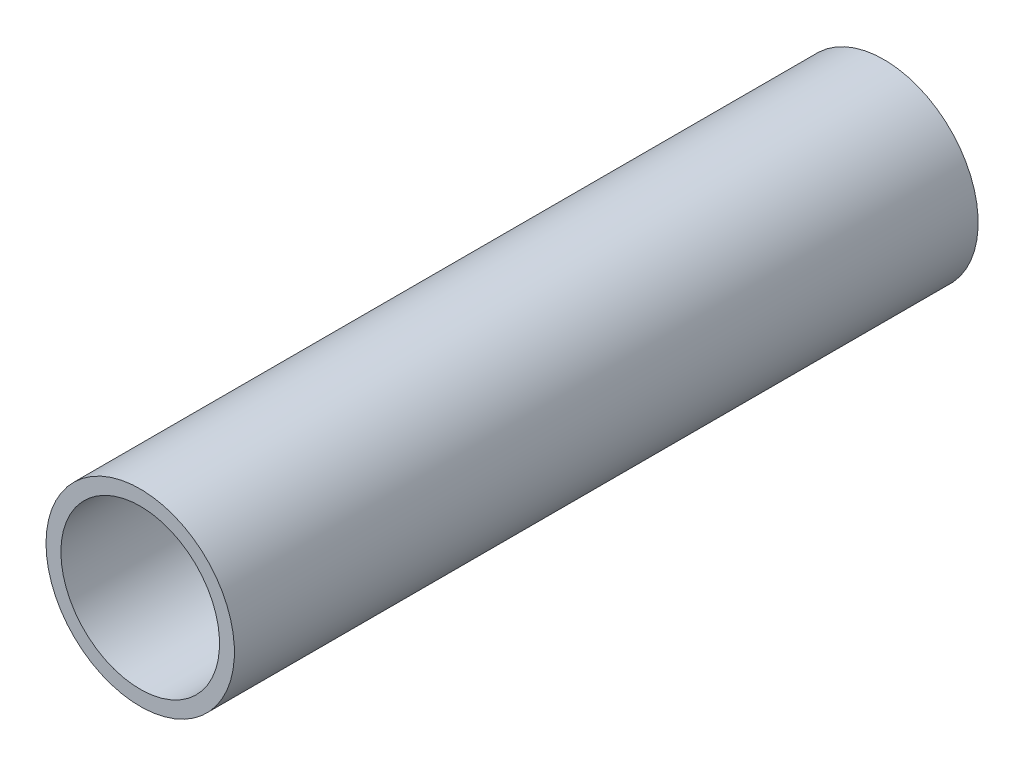
ISO-10303-21;
HEADER;
FILE_DESCRIPTION(('STEP AP214'),'2;1');
FILE_NAME('part.step','',(''),(''),'','','');
FILE_SCHEMA(('AUTOMOTIVE_DESIGN { 1 0 10303 214 1 1 1 1 }'));
ENDSEC;
DATA;
#1=APPLICATION_CONTEXT('core data for automotive mechanical design processes');
#2=APPLICATION_PROTOCOL_DEFINITION('international standard','automotive_design',2000,#1);
#3=PRODUCT_CONTEXT('',#1,'mechanical');
#4=PRODUCT('Part','Part','',(#3));
#5=PRODUCT_RELATED_PRODUCT_CATEGORY('part','',(#4));
#6=PRODUCT_DEFINITION_FORMATION('','',#4);
#7=PRODUCT_DEFINITION_CONTEXT('part definition',#1,'design');
#8=PRODUCT_DEFINITION('design','',#6,#7);
#9=PRODUCT_DEFINITION_SHAPE('','',#8);
#10=(LENGTH_UNIT() NAMED_UNIT(*) SI_UNIT(.MILLI.,.METRE.));
#11=(NAMED_UNIT(*) PLANE_ANGLE_UNIT() SI_UNIT($,.RADIAN.));
#12=(NAMED_UNIT(*) SI_UNIT($,.STERADIAN.) SOLID_ANGLE_UNIT());
#13=UNCERTAINTY_MEASURE_WITH_UNIT(LENGTH_MEASURE(1.E-05),#10,'distance_accuracy_value','');
#14=(GEOMETRIC_REPRESENTATION_CONTEXT(3) GLOBAL_UNCERTAINTY_ASSIGNED_CONTEXT((#13)) GLOBAL_UNIT_ASSIGNED_CONTEXT((#10,
#11,#12)) REPRESENTATION_CONTEXT('',''));
#15=CARTESIAN_POINT('',(0.,0.,0.));
#16=DIRECTION('',(0.,0.,1.));
#17=DIRECTION('',(1.,0.,0.));
#18=AXIS2_PLACEMENT_3D('',#15,#16,#17);
#19=CARTESIAN_POINT('',(-43.,18.,37.5));
#20=DIRECTION('',(0.,0.,-1.));
#21=DIRECTION('',(-1.,0.,0.));
#22=AXIS2_PLACEMENT_3D('',#19,#20,#21);
#23=CYLINDRICAL_SURFACE('',#22,8.00000000000001);
#24=CARTESIAN_POINT('',(-43.,18.,-37.5));
#25=DIRECTION('',(0.,0.,-1.));
#26=DIRECTION('',(-1.,0.,0.));
#27=AXIS2_PLACEMENT_3D('',#24,#25,#26);
#28=CIRCLE('',#27,8.00000000000001);
#29=CARTESIAN_POINT('',(-51.,18.,-37.5));
#30=VERTEX_POINT('',#29);
#31=EDGE_CURVE('E27',#30,#30,#28,.T.);
#32=ORIENTED_EDGE('',*,*,#31,.T.);
#33=EDGE_LOOP('',(#32));
#34=FACE_BOUND('',#33,.T.);
#35=CARTESIAN_POINT('',(-43.,18.,37.5));
#36=DIRECTION('',(0.,0.,-1.));
#37=DIRECTION('',(-1.,0.,0.));
#38=AXIS2_PLACEMENT_3D('',#35,#36,#37);
#39=CIRCLE('',#38,8.00000000000001);
#40=CARTESIAN_POINT('',(-51.,18.,37.5));
#41=VERTEX_POINT('',#40);
#42=EDGE_CURVE('E18',#41,#41,#39,.T.);
#43=ORIENTED_EDGE('',*,*,#42,.F.);
#44=EDGE_LOOP('',(#43));
#45=FACE_BOUND('',#44,.T.);
#46=ADVANCED_FACE('F15',(#34,#45),#23,.F.);
#47=CARTESIAN_POINT('',(-43.,18.,37.5));
#48=DIRECTION('',(0.,0.,1.));
#49=DIRECTION('',(1.,0.,0.));
#50=AXIS2_PLACEMENT_3D('',#47,#48,#49);
#51=PLANE('',#50);
#52=ORIENTED_EDGE('',*,*,#42,.T.);
#53=EDGE_LOOP('',(#52));
#54=FACE_BOUND('',#53,.T.);
#55=CARTESIAN_POINT('',(-43.,18.,37.5));
#56=DIRECTION('',(0.,0.,-1.));
#57=DIRECTION('',(-1.,0.,0.));
#58=AXIS2_PLACEMENT_3D('',#55,#56,#57);
#59=CIRCLE('',#58,9.5);
#60=CARTESIAN_POINT('',(-52.5,18.,37.5));
#61=VERTEX_POINT('',#60);
#62=EDGE_CURVE('E22',#61,#61,#59,.T.);
#63=ORIENTED_EDGE('',*,*,#62,.F.);
#64=EDGE_LOOP('',(#63));
#65=FACE_BOUND('',#64,.T.);
#66=ADVANCED_FACE('F35',(#54,#65),#51,.T.);
#67=CARTESIAN_POINT('',(-43.,18.,-37.5));
#68=DIRECTION('',(0.,0.,1.));
#69=DIRECTION('',(1.,0.,0.));
#70=AXIS2_PLACEMENT_3D('',#67,#68,#69);
#71=PLANE('',#70);
#72=ORIENTED_EDGE('',*,*,#31,.F.);
#73=EDGE_LOOP('',(#72));
#74=FACE_BOUND('',#73,.T.);
#75=CARTESIAN_POINT('',(-43.,18.,-37.5));
#76=DIRECTION('',(0.,0.,-1.));
#77=DIRECTION('',(-1.,0.,0.));
#78=AXIS2_PLACEMENT_3D('',#75,#76,#77);
#79=CIRCLE('',#78,9.5);
#80=CARTESIAN_POINT('',(-52.5,18.,-37.5));
#81=VERTEX_POINT('',#80);
#82=EDGE_CURVE('E10',#81,#81,#79,.F.);
#83=ORIENTED_EDGE('',*,*,#82,.F.);
#84=EDGE_LOOP('',(#83));
#85=FACE_BOUND('',#84,.T.);
#86=ADVANCED_FACE('F43',(#74,#85),#71,.F.);
#87=CARTESIAN_POINT('',(-43.,18.,37.5));
#88=DIRECTION('',(0.,0.,-1.));
#89=DIRECTION('',(-1.,0.,0.));
#90=AXIS2_PLACEMENT_3D('',#87,#88,#89);
#91=CYLINDRICAL_SURFACE('',#90,9.5);
#92=ORIENTED_EDGE('',*,*,#82,.T.);
#93=EDGE_LOOP('',(#92));
#94=FACE_BOUND('',#93,.T.);
#95=ORIENTED_EDGE('',*,*,#62,.T.);
#96=EDGE_LOOP('',(#95));
#97=FACE_BOUND('',#96,.T.);
#98=ADVANCED_FACE('F44',(#94,#97),#91,.T.);
#99=CLOSED_SHELL('',(#46,#66,#86,#98));
#100=MANIFOLD_SOLID_BREP('B1',#99);
#101=ADVANCED_BREP_SHAPE_REPRESENTATION('',(#18,#100),#14);
#102=SHAPE_DEFINITION_REPRESENTATION(#9,#101);
ENDSEC;
END-ISO-10303-21;
